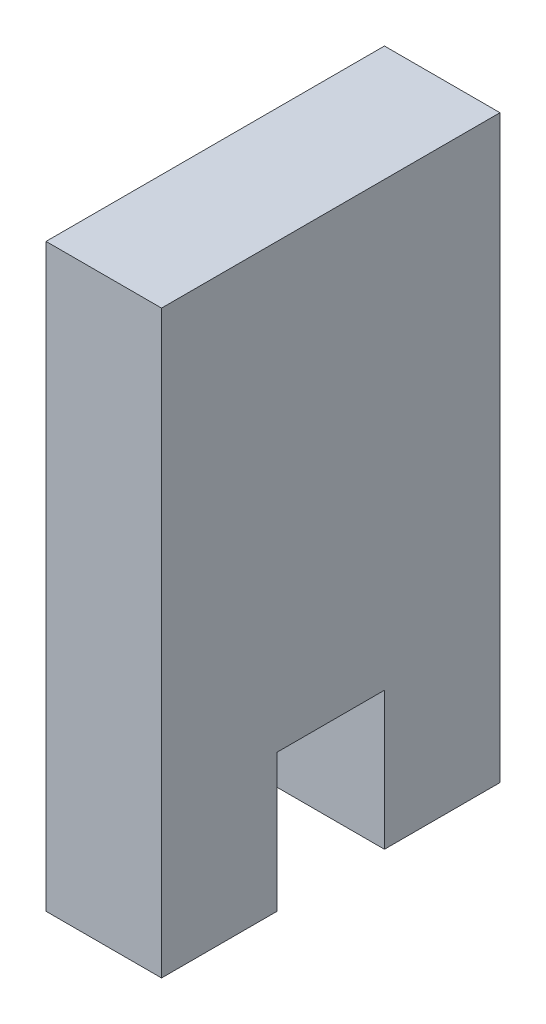
ISO-10303-21;
HEADER;
FILE_DESCRIPTION(('STEP AP214'),'2;1');
FILE_NAME('part.step','',(''),(''),'','','');
FILE_SCHEMA(('AUTOMOTIVE_DESIGN { 1 0 10303 214 1 1 1 1 }'));
ENDSEC;
DATA;
#1=APPLICATION_CONTEXT('core data for automotive mechanical design processes');
#2=APPLICATION_PROTOCOL_DEFINITION('international standard','automotive_design',2000,#1);
#3=PRODUCT_CONTEXT('',#1,'mechanical');
#4=PRODUCT('Part','Part','',(#3));
#5=PRODUCT_RELATED_PRODUCT_CATEGORY('part','',(#4));
#6=PRODUCT_DEFINITION_FORMATION('','',#4);
#7=PRODUCT_DEFINITION_CONTEXT('part definition',#1,'design');
#8=PRODUCT_DEFINITION('design','',#6,#7);
#9=PRODUCT_DEFINITION_SHAPE('','',#8);
#10=(LENGTH_UNIT() NAMED_UNIT(*) SI_UNIT(.MILLI.,.METRE.));
#11=(NAMED_UNIT(*) PLANE_ANGLE_UNIT() SI_UNIT($,.RADIAN.));
#12=(NAMED_UNIT(*) SI_UNIT($,.STERADIAN.) SOLID_ANGLE_UNIT());
#13=UNCERTAINTY_MEASURE_WITH_UNIT(LENGTH_MEASURE(1.E-05),#10,'distance_accuracy_value','');
#14=(GEOMETRIC_REPRESENTATION_CONTEXT(3) GLOBAL_UNCERTAINTY_ASSIGNED_CONTEXT((#13)) GLOBAL_UNIT_ASSIGNED_CONTEXT((#10,
#11,#12)) REPRESENTATION_CONTEXT('',''));
#15=CARTESIAN_POINT('',(0.,0.,0.));
#16=DIRECTION('',(0.,0.,1.));
#17=DIRECTION('',(1.,0.,0.));
#18=AXIS2_PLACEMENT_3D('',#15,#16,#17);
#19=CARTESIAN_POINT('',(6.35,7.57341472096977,0.));
#20=DIRECTION('',(0.,1.,0.));
#21=DIRECTION('',(0.,0.,1.));
#22=AXIS2_PLACEMENT_3D('',#19,#20,#21);
#23=PLANE('',#22);
#24=DIRECTION('',(0.,0.,-1.));
#25=VECTOR('',#24,1.);
#26=CARTESIAN_POINT('',(0.,7.57341472096977,0.));
#27=LINE('',#26,#25);
#28=CARTESIAN_POINT('',(0.,7.57341472096977,-6.35));
#29=VERTEX_POINT('',#28);
#30=CARTESIAN_POINT('',(0.,7.57341472096977,-12.2539824354925));
#31=VERTEX_POINT('',#30);
#32=EDGE_CURVE('E131',#29,#31,#27,.T.);
#33=ORIENTED_EDGE('',*,*,#32,.T.);
#34=DIRECTION('',(-1.,0.,0.));
#35=VECTOR('',#34,1.);
#36=CARTESIAN_POINT('',(6.35,7.57341472096977,-12.2539824354925));
#37=LINE('',#36,#35);
#38=CARTESIAN_POINT('',(6.35,7.57341472096977,-12.2539824354925));
#39=VERTEX_POINT('',#38);
#40=EDGE_CURVE('E11',#39,#31,#37,.T.);
#41=ORIENTED_EDGE('',*,*,#40,.F.);
#42=DIRECTION('',(0.,0.,-1.));
#43=VECTOR('',#42,1.);
#44=CARTESIAN_POINT('',(6.35,7.57341472096977,0.));
#45=LINE('',#44,#43);
#46=CARTESIAN_POINT('',(6.35,7.57341472096977,-6.35));
#47=VERTEX_POINT('',#46);
#48=EDGE_CURVE('E146',#47,#39,#45,.T.);
#49=ORIENTED_EDGE('',*,*,#48,.F.);
#50=DIRECTION('',(-1.,0.,0.));
#51=VECTOR('',#50,1.);
#52=CARTESIAN_POINT('',(6.35,7.57341472096977,-6.35));
#53=LINE('',#52,#51);
#54=EDGE_CURVE('E130',#47,#29,#53,.T.);
#55=ORIENTED_EDGE('',*,*,#54,.T.);
#56=EDGE_LOOP('',(#33,#41,#49,#55));
#57=FACE_BOUND('',#56,.T.);
#58=ADVANCED_FACE('F33',(#57),#23,.F.);
#59=CARTESIAN_POINT('',(6.35,0.,-12.2539824354925));
#60=DIRECTION('',(0.,0.,-1.));
#61=DIRECTION('',(-1.,0.,0.));
#62=AXIS2_PLACEMENT_3D('',#59,#60,#61);
#63=PLANE('',#62);
#64=DIRECTION('',(0.,-1.,0.));
#65=VECTOR('',#64,1.);
#66=CARTESIAN_POINT('',(0.,0.,-12.2539824354925));
#67=LINE('',#66,#65);
#68=CARTESIAN_POINT('',(0.,0.,-12.2539824354925));
#69=VERTEX_POINT('',#68);
#70=EDGE_CURVE('E134',#31,#69,#67,.T.);
#71=ORIENTED_EDGE('',*,*,#70,.T.);
#72=DIRECTION('',(-1.,0.,0.));
#73=VECTOR('',#72,1.);
#74=CARTESIAN_POINT('',(6.35,0.,-12.2539824354925));
#75=LINE('',#74,#73);
#76=CARTESIAN_POINT('',(6.35,0.,-12.2539824354925));
#77=VERTEX_POINT('',#76);
#78=EDGE_CURVE('E41',#77,#69,#75,.T.);
#79=ORIENTED_EDGE('',*,*,#78,.F.);
#80=DIRECTION('',(0.,-1.,0.));
#81=VECTOR('',#80,1.);
#82=CARTESIAN_POINT('',(6.35,0.,-12.2539824354925));
#83=LINE('',#82,#81);
#84=EDGE_CURVE('E91',#39,#77,#83,.T.);
#85=ORIENTED_EDGE('',*,*,#84,.F.);
#86=ORIENTED_EDGE('',*,*,#40,.T.);
#87=EDGE_LOOP('',(#71,#79,#85,#86));
#88=FACE_BOUND('',#87,.T.);
#89=ADVANCED_FACE('F174',(#88),#63,.F.);
#90=CARTESIAN_POINT('',(6.35,0.,0.));
#91=DIRECTION('',(0.,1.,0.));
#92=DIRECTION('',(0.,0.,1.));
#93=AXIS2_PLACEMENT_3D('',#90,#91,#92);
#94=PLANE('',#93);
#95=DIRECTION('',(0.,0.,-1.));
#96=VECTOR('',#95,1.);
#97=CARTESIAN_POINT('',(0.,0.,0.));
#98=LINE('',#97,#96);
#99=CARTESIAN_POINT('',(0.,0.,-18.6039824354925));
#100=VERTEX_POINT('',#99);
#101=EDGE_CURVE('E136',#69,#100,#98,.T.);
#102=ORIENTED_EDGE('',*,*,#101,.T.);
#103=DIRECTION('',(-1.,0.,0.));
#104=VECTOR('',#103,1.);
#105=CARTESIAN_POINT('',(6.35,0.,-18.6039824354925));
#106=LINE('',#105,#104);
#107=CARTESIAN_POINT('',(6.35,0.,-18.6039824354925));
#108=VERTEX_POINT('',#107);
#109=EDGE_CURVE('E152',#108,#100,#106,.T.);
#110=ORIENTED_EDGE('',*,*,#109,.F.);
#111=DIRECTION('',(0.,0.,-1.));
#112=VECTOR('',#111,1.);
#113=CARTESIAN_POINT('',(6.35,0.,0.));
#114=LINE('',#113,#112);
#115=EDGE_CURVE('E119',#77,#108,#114,.T.);
#116=ORIENTED_EDGE('',*,*,#115,.F.);
#117=ORIENTED_EDGE('',*,*,#78,.T.);
#118=EDGE_LOOP('',(#102,#110,#116,#117));
#119=FACE_BOUND('',#118,.T.);
#120=ADVANCED_FACE('F158',(#119),#94,.F.);
#121=CARTESIAN_POINT('',(6.35,0.,-18.6039824354925));
#122=DIRECTION('',(0.,0.,1.));
#123=DIRECTION('',(1.,0.,0.));
#124=AXIS2_PLACEMENT_3D('',#121,#122,#123);
#125=PLANE('',#124);
#126=DIRECTION('',(0.,1.,0.));
#127=VECTOR('',#126,1.);
#128=CARTESIAN_POINT('',(0.,0.,-18.6039824354925));
#129=LINE('',#128,#127);
#130=CARTESIAN_POINT('',(0.,31.8925413179871,-18.6039824354925));
#131=VERTEX_POINT('',#130);
#132=EDGE_CURVE('E138',#100,#131,#129,.T.);
#133=ORIENTED_EDGE('',*,*,#132,.T.);
#134=DIRECTION('',(-1.,0.,0.));
#135=VECTOR('',#134,1.);
#136=CARTESIAN_POINT('',(6.35,31.8925413179871,-18.6039824354925));
#137=LINE('',#136,#135);
#138=CARTESIAN_POINT('',(6.35,31.8925413179871,-18.6039824354925));
#139=VERTEX_POINT('',#138);
#140=EDGE_CURVE('E150',#139,#131,#137,.T.);
#141=ORIENTED_EDGE('',*,*,#140,.F.);
#142=DIRECTION('',(0.,1.,0.));
#143=VECTOR('',#142,1.);
#144=CARTESIAN_POINT('',(6.35,0.,-18.6039824354925));
#145=LINE('',#144,#143);
#146=EDGE_CURVE('E125',#108,#139,#145,.T.);
#147=ORIENTED_EDGE('',*,*,#146,.F.);
#148=ORIENTED_EDGE('',*,*,#109,.T.);
#149=EDGE_LOOP('',(#133,#141,#147,#148));
#150=FACE_BOUND('',#149,.T.);
#151=ADVANCED_FACE('F167',(#150),#125,.F.);
#152=CARTESIAN_POINT('',(6.35,31.8925413179871,0.));
#153=DIRECTION('',(0.,1.,0.));
#154=DIRECTION('',(0.,0.,1.));
#155=AXIS2_PLACEMENT_3D('',#152,#153,#154);
#156=PLANE('',#155);
#157=DIRECTION('',(0.,0.,-1.));
#158=VECTOR('',#157,1.);
#159=CARTESIAN_POINT('',(0.,31.8925413179871,0.));
#160=LINE('',#159,#158);
#161=CARTESIAN_POINT('',(0.,31.8925413179871,0.));
#162=VERTEX_POINT('',#161);
#163=EDGE_CURVE('E141',#162,#131,#160,.T.);
#164=ORIENTED_EDGE('',*,*,#163,.F.);
#165=DIRECTION('',(-1.,0.,0.));
#166=VECTOR('',#165,1.);
#167=CARTESIAN_POINT('',(6.35,31.8925413179871,0.));
#168=LINE('',#167,#166);
#169=CARTESIAN_POINT('',(6.35,31.8925413179871,0.));
#170=VERTEX_POINT('',#169);
#171=EDGE_CURVE('E113',#170,#162,#168,.T.);
#172=ORIENTED_EDGE('',*,*,#171,.F.);
#173=DIRECTION('',(0.,0.,-1.));
#174=VECTOR('',#173,1.);
#175=CARTESIAN_POINT('',(6.35,31.8925413179871,0.));
#176=LINE('',#175,#174);
#177=EDGE_CURVE('E123',#170,#139,#176,.T.);
#178=ORIENTED_EDGE('',*,*,#177,.T.);
#179=ORIENTED_EDGE('',*,*,#140,.T.);
#180=EDGE_LOOP('',(#164,#172,#178,#179));
#181=FACE_BOUND('',#180,.T.);
#182=ADVANCED_FACE('F184',(#181),#156,.T.);
#183=CARTESIAN_POINT('',(6.35,0.,0.));
#184=DIRECTION('',(0.,0.,1.));
#185=DIRECTION('',(1.,0.,0.));
#186=AXIS2_PLACEMENT_3D('',#183,#184,#185);
#187=PLANE('',#186);
#188=DIRECTION('',(0.,1.,0.));
#189=VECTOR('',#188,1.);
#190=CARTESIAN_POINT('',(0.,0.,0.));
#191=LINE('',#190,#189);
#192=CARTESIAN_POINT('',(0.,0.,0.));
#193=VERTEX_POINT('',#192);
#194=EDGE_CURVE('E112',#193,#162,#191,.T.);
#195=ORIENTED_EDGE('',*,*,#194,.F.);
#196=DIRECTION('',(-1.,0.,0.));
#197=VECTOR('',#196,1.);
#198=CARTESIAN_POINT('',(6.35,0.,0.));
#199=LINE('',#198,#197);
#200=CARTESIAN_POINT('',(6.35,0.,0.));
#201=VERTEX_POINT('',#200);
#202=EDGE_CURVE('E106',#201,#193,#199,.T.);
#203=ORIENTED_EDGE('',*,*,#202,.F.);
#204=DIRECTION('',(0.,1.,0.));
#205=VECTOR('',#204,1.);
#206=CARTESIAN_POINT('',(6.35,0.,0.));
#207=LINE('',#206,#205);
#208=EDGE_CURVE('E110',#201,#170,#207,.T.);
#209=ORIENTED_EDGE('',*,*,#208,.T.);
#210=ORIENTED_EDGE('',*,*,#171,.T.);
#211=EDGE_LOOP('',(#195,#203,#209,#210));
#212=FACE_BOUND('',#211,.T.);
#213=ADVANCED_FACE('F108',(#212),#187,.T.);
#214=CARTESIAN_POINT('',(0.,0.,-6.35));
#215=VERTEX_POINT('',#214);
#216=EDGE_CURVE('E77',#193,#215,#98,.T.);
#217=ORIENTED_EDGE('',*,*,#216,.T.);
#218=DIRECTION('',(-1.,0.,0.));
#219=VECTOR('',#218,1.);
#220=CARTESIAN_POINT('',(6.35,0.,-6.35));
#221=LINE('',#220,#219);
#222=CARTESIAN_POINT('',(6.35,0.,-6.35));
#223=VERTEX_POINT('',#222);
#224=EDGE_CURVE('E114',#223,#215,#221,.T.);
#225=ORIENTED_EDGE('',*,*,#224,.F.);
#226=EDGE_CURVE('E116',#201,#223,#114,.T.);
#227=ORIENTED_EDGE('',*,*,#226,.F.);
#228=ORIENTED_EDGE('',*,*,#202,.T.);
#229=EDGE_LOOP('',(#217,#225,#227,#228));
#230=FACE_BOUND('',#229,.T.);
#231=ADVANCED_FACE('F117',(#230),#94,.F.);
#232=CARTESIAN_POINT('',(6.35,0.,-6.35));
#233=DIRECTION('',(0.,0.,1.));
#234=DIRECTION('',(1.,0.,0.));
#235=AXIS2_PLACEMENT_3D('',#232,#233,#234);
#236=PLANE('',#235);
#237=DIRECTION('',(0.,1.,0.));
#238=VECTOR('',#237,1.);
#239=CARTESIAN_POINT('',(0.,0.,-6.35));
#240=LINE('',#239,#238);
#241=EDGE_CURVE('E83',#215,#29,#240,.T.);
#242=ORIENTED_EDGE('',*,*,#241,.T.);
#243=ORIENTED_EDGE('',*,*,#54,.F.);
#244=DIRECTION('',(0.,1.,0.));
#245=VECTOR('',#244,1.);
#246=CARTESIAN_POINT('',(6.35,0.,-6.35));
#247=LINE('',#246,#245);
#248=EDGE_CURVE('E49',#223,#47,#247,.T.);
#249=ORIENTED_EDGE('',*,*,#248,.F.);
#250=ORIENTED_EDGE('',*,*,#224,.T.);
#251=EDGE_LOOP('',(#242,#243,#249,#250));
#252=FACE_BOUND('',#251,.T.);
#253=ADVANCED_FACE('F191',(#252),#236,.F.);
#254=CARTESIAN_POINT('',(6.35,0.,0.));
#255=DIRECTION('',(1.,0.,0.));
#256=DIRECTION('',(0.,0.,-1.));
#257=AXIS2_PLACEMENT_3D('',#254,#255,#256);
#258=PLANE('',#257);
#259=ORIENTED_EDGE('',*,*,#48,.T.);
#260=ORIENTED_EDGE('',*,*,#84,.T.);
#261=ORIENTED_EDGE('',*,*,#115,.T.);
#262=ORIENTED_EDGE('',*,*,#146,.T.);
#263=ORIENTED_EDGE('',*,*,#177,.F.);
#264=ORIENTED_EDGE('',*,*,#208,.F.);
#265=ORIENTED_EDGE('',*,*,#226,.T.);
#266=ORIENTED_EDGE('',*,*,#248,.T.);
#267=EDGE_LOOP('',(#259,#260,#261,#262,#263,#264,#265,#266));
#268=FACE_BOUND('',#267,.T.);
#269=ADVANCED_FACE('F121',(#268),#258,.T.);
#270=CARTESIAN_POINT('',(0.,0.,0.));
#271=DIRECTION('',(1.,0.,0.));
#272=DIRECTION('',(0.,0.,-1.));
#273=AXIS2_PLACEMENT_3D('',#270,#271,#272);
#274=PLANE('',#273);
#275=ORIENTED_EDGE('',*,*,#32,.F.);
#276=ORIENTED_EDGE('',*,*,#241,.F.);
#277=ORIENTED_EDGE('',*,*,#216,.F.);
#278=ORIENTED_EDGE('',*,*,#194,.T.);
#279=ORIENTED_EDGE('',*,*,#163,.T.);
#280=ORIENTED_EDGE('',*,*,#132,.F.);
#281=ORIENTED_EDGE('',*,*,#101,.F.);
#282=ORIENTED_EDGE('',*,*,#70,.F.);
#283=EDGE_LOOP('',(#275,#276,#277,#278,#279,#280,#281,#282));
#284=FACE_BOUND('',#283,.T.);
#285=ADVANCED_FACE('F163',(#284),#274,.F.);
#286=CLOSED_SHELL('',(#58,#89,#120,#151,#182,#213,#231,#253,#269,#285));
#287=MANIFOLD_SOLID_BREP('B2',#286);
#288=ADVANCED_BREP_SHAPE_REPRESENTATION('',(#18,#287),#14);
#289=SHAPE_DEFINITION_REPRESENTATION(#9,#288);
ENDSEC;
END-ISO-10303-21;
